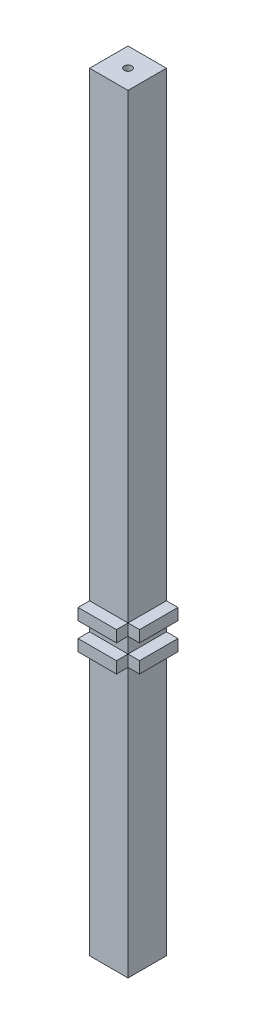
ISO-10303-21;
HEADER;
FILE_DESCRIPTION(('STEP AP214'),'2;1');
FILE_NAME('part.step','',(''),(''),'','','');
FILE_SCHEMA(('AUTOMOTIVE_DESIGN { 1 0 10303 214 1 1 1 1 }'));
ENDSEC;
DATA;
#1=APPLICATION_CONTEXT('core data for automotive mechanical design processes');
#2=APPLICATION_PROTOCOL_DEFINITION('international standard','automotive_design',2000,#1);
#3=PRODUCT_CONTEXT('',#1,'mechanical');
#4=PRODUCT('Part','Part','',(#3));
#5=PRODUCT_RELATED_PRODUCT_CATEGORY('part','',(#4));
#6=PRODUCT_DEFINITION_FORMATION('','',#4);
#7=PRODUCT_DEFINITION_CONTEXT('part definition',#1,'design');
#8=PRODUCT_DEFINITION('design','',#6,#7);
#9=PRODUCT_DEFINITION_SHAPE('','',#8);
#10=(LENGTH_UNIT() NAMED_UNIT(*) SI_UNIT(.MILLI.,.METRE.));
#11=(NAMED_UNIT(*) PLANE_ANGLE_UNIT() SI_UNIT($,.RADIAN.));
#12=(NAMED_UNIT(*) SI_UNIT($,.STERADIAN.) SOLID_ANGLE_UNIT());
#13=UNCERTAINTY_MEASURE_WITH_UNIT(LENGTH_MEASURE(1.E-05),#10,'distance_accuracy_value','');
#14=(GEOMETRIC_REPRESENTATION_CONTEXT(3) GLOBAL_UNCERTAINTY_ASSIGNED_CONTEXT((#13)) GLOBAL_UNIT_ASSIGNED_CONTEXT((#10,
#11,#12)) REPRESENTATION_CONTEXT('',''));
#15=CARTESIAN_POINT('',(0.,0.,0.));
#16=DIRECTION('',(0.,0.,1.));
#17=DIRECTION('',(1.,0.,0.));
#18=AXIS2_PLACEMENT_3D('',#15,#16,#17);
#19=CARTESIAN_POINT('',(5.,200.,5.));
#20=DIRECTION('',(-1.,0.,0.));
#21=DIRECTION('',(0.,0.,1.));
#22=AXIS2_PLACEMENT_3D('',#19,#20,#21);
#23=PLANE('',#22);
#24=DIRECTION('',(0.,0.,1.));
#25=VECTOR('',#24,1.);
#26=CARTESIAN_POINT('',(5.,73.,5.));
#27=LINE('',#26,#25);
#28=CARTESIAN_POINT('',(5.,73.,-5.));
#29=VERTEX_POINT('',#28);
#30=CARTESIAN_POINT('',(5.,73.,5.));
#31=VERTEX_POINT('',#30);
#32=EDGE_CURVE('E61',#29,#31,#27,.T.);
#33=ORIENTED_EDGE('',*,*,#32,.F.);
#34=DIRECTION('',(0.,-1.,0.));
#35=VECTOR('',#34,1.);
#36=CARTESIAN_POINT('',(5.,200.,-5.));
#37=LINE('',#36,#35);
#38=CARTESIAN_POINT('',(5.,77.,-5.));
#39=VERTEX_POINT('',#38);
#40=EDGE_CURVE('E53',#39,#29,#37,.T.);
#41=ORIENTED_EDGE('',*,*,#40,.F.);
#42=DIRECTION('',(0.,0.,-1.));
#43=VECTOR('',#42,1.);
#44=CARTESIAN_POINT('',(5.,77.,5.));
#45=LINE('',#44,#43);
#46=CARTESIAN_POINT('',(5.,77.,5.));
#47=VERTEX_POINT('',#46);
#48=EDGE_CURVE('E230',#47,#39,#45,.T.);
#49=ORIENTED_EDGE('',*,*,#48,.F.);
#50=DIRECTION('',(0.,-1.,0.));
#51=VECTOR('',#50,1.);
#52=CARTESIAN_POINT('',(5.,200.,5.));
#53=LINE('',#52,#51);
#54=EDGE_CURVE('E368',#47,#31,#53,.T.);
#55=ORIENTED_EDGE('',*,*,#54,.T.);
#56=EDGE_LOOP('',(#33,#41,#49,#55));
#57=FACE_BOUND('',#56,.T.);
#58=ADVANCED_FACE('F45',(#57),#23,.F.);
#59=DIRECTION('',(0.,-1.,0.));
#60=VECTOR('',#59,1.);
#61=CARTESIAN_POINT('',(5.,70.,5.));
#62=LINE('',#61,#60);
#63=CARTESIAN_POINT('',(5.,70.,5.));
#64=VERTEX_POINT('',#63);
#65=EDGE_CURVE('E198',#31,#64,#62,.T.);
#66=ORIENTED_EDGE('',*,*,#65,.F.);
#67=DIRECTION('',(0.,0.,-1.));
#68=VECTOR('',#67,1.);
#69=CARTESIAN_POINT('',(5.,73.,8.));
#70=LINE('',#69,#68);
#71=CARTESIAN_POINT('',(5.,73.,8.));
#72=VERTEX_POINT('',#71);
#73=EDGE_CURVE('E276',#72,#31,#70,.T.);
#74=ORIENTED_EDGE('',*,*,#73,.F.);
#75=DIRECTION('',(0.,1.,0.));
#76=VECTOR('',#75,1.);
#77=CARTESIAN_POINT('',(5.,70.,8.));
#78=LINE('',#77,#76);
#79=CARTESIAN_POINT('',(5.,70.,8.));
#80=VERTEX_POINT('',#79);
#81=EDGE_CURVE('E258',#80,#72,#78,.T.);
#82=ORIENTED_EDGE('',*,*,#81,.F.);
#83=DIRECTION('',(0.,0.,-1.));
#84=VECTOR('',#83,1.);
#85=CARTESIAN_POINT('',(5.,70.,8.));
#86=LINE('',#85,#84);
#87=EDGE_CURVE('E280',#80,#64,#86,.T.);
#88=ORIENTED_EDGE('',*,*,#87,.T.);
#89=EDGE_LOOP('',(#66,#74,#82,#88));
#90=FACE_BOUND('',#89,.T.);
#91=ADVANCED_FACE('F420',(#90),#23,.F.);
#92=DIRECTION('',(0.,0.,-1.));
#93=VECTOR('',#92,1.);
#94=CARTESIAN_POINT('',(5.,70.,5.));
#95=LINE('',#94,#93);
#96=CARTESIAN_POINT('',(5.,70.,-5.));
#97=VERTEX_POINT('',#96);
#98=EDGE_CURVE('E397',#64,#97,#95,.T.);
#99=ORIENTED_EDGE('',*,*,#98,.F.);
#100=CARTESIAN_POINT('',(5.,0.,5.));
#101=VERTEX_POINT('',#100);
#102=EDGE_CURVE('E350',#64,#101,#53,.T.);
#103=ORIENTED_EDGE('',*,*,#102,.T.);
#104=DIRECTION('',(0.,0.,-1.));
#105=VECTOR('',#104,1.);
#106=CARTESIAN_POINT('',(5.,0.,5.));
#107=LINE('',#106,#105);
#108=CARTESIAN_POINT('',(5.,0.,-5.));
#109=VERTEX_POINT('',#108);
#110=EDGE_CURVE('E332',#101,#109,#107,.T.);
#111=ORIENTED_EDGE('',*,*,#110,.T.);
#112=EDGE_CURVE('E54',#97,#109,#37,.T.);
#113=ORIENTED_EDGE('',*,*,#112,.F.);
#114=EDGE_LOOP('',(#99,#103,#111,#113));
#115=FACE_BOUND('',#114,.T.);
#116=ADVANCED_FACE('F407',(#115),#23,.F.);
#117=DIRECTION('',(0.,0.,1.));
#118=VECTOR('',#117,1.);
#119=CARTESIAN_POINT('',(5.,80.,5.));
#120=LINE('',#119,#118);
#121=CARTESIAN_POINT('',(5.,80.,-5.));
#122=VERTEX_POINT('',#121);
#123=CARTESIAN_POINT('',(5.,80.,5.));
#124=VERTEX_POINT('',#123);
#125=EDGE_CURVE('E69',#122,#124,#120,.T.);
#126=ORIENTED_EDGE('',*,*,#125,.F.);
#127=CARTESIAN_POINT('',(5.,200.,-5.));
#128=VERTEX_POINT('',#127);
#129=EDGE_CURVE('E11',#128,#122,#37,.T.);
#130=ORIENTED_EDGE('',*,*,#129,.F.);
#131=DIRECTION('',(0.,0.,-1.));
#132=VECTOR('',#131,1.);
#133=CARTESIAN_POINT('',(5.,200.,5.));
#134=LINE('',#133,#132);
#135=CARTESIAN_POINT('',(5.,200.,5.));
#136=VERTEX_POINT('',#135);
#137=EDGE_CURVE('E336',#136,#128,#134,.T.);
#138=ORIENTED_EDGE('',*,*,#137,.F.);
#139=EDGE_CURVE('E364',#136,#124,#53,.T.);
#140=ORIENTED_EDGE('',*,*,#139,.T.);
#141=EDGE_LOOP('',(#126,#130,#138,#140));
#142=FACE_BOUND('',#141,.T.);
#143=ADVANCED_FACE('F455',(#142),#23,.F.);
#144=DIRECTION('',(0.,-1.,0.));
#145=VECTOR('',#144,1.);
#146=CARTESIAN_POINT('',(5.,77.,5.));
#147=LINE('',#146,#145);
#148=EDGE_CURVE('E235',#124,#47,#147,.T.);
#149=ORIENTED_EDGE('',*,*,#148,.F.);
#150=DIRECTION('',(0.,0.,-1.));
#151=VECTOR('',#150,1.);
#152=CARTESIAN_POINT('',(5.,80.,8.));
#153=LINE('',#152,#151);
#154=CARTESIAN_POINT('',(5.,80.,8.));
#155=VERTEX_POINT('',#154);
#156=EDGE_CURVE('E292',#155,#124,#153,.T.);
#157=ORIENTED_EDGE('',*,*,#156,.F.);
#158=DIRECTION('',(0.,1.,0.));
#159=VECTOR('',#158,1.);
#160=CARTESIAN_POINT('',(5.,77.,8.));
#161=LINE('',#160,#159);
#162=CARTESIAN_POINT('',(5.,77.,8.));
#163=VERTEX_POINT('',#162);
#164=EDGE_CURVE('E311',#163,#155,#161,.T.);
#165=ORIENTED_EDGE('',*,*,#164,.F.);
#166=DIRECTION('',(0.,0.,-1.));
#167=VECTOR('',#166,1.);
#168=CARTESIAN_POINT('',(5.,77.,8.));
#169=LINE('',#168,#167);
#170=EDGE_CURVE('E205',#163,#47,#169,.T.);
#171=ORIENTED_EDGE('',*,*,#170,.T.);
#172=EDGE_LOOP('',(#149,#157,#165,#171));
#173=FACE_BOUND('',#172,.T.);
#174=ADVANCED_FACE('F450',(#173),#23,.F.);
#175=CARTESIAN_POINT('',(-5.,200.,5.));
#176=DIRECTION('',(0.,0.,-1.));
#177=DIRECTION('',(-1.,0.,0.));
#178=AXIS2_PLACEMENT_3D('',#175,#176,#177);
#179=PLANE('',#178);
#180=DIRECTION('',(-1.,0.,0.));
#181=VECTOR('',#180,1.);
#182=CARTESIAN_POINT('',(-5.,73.,5.));
#183=LINE('',#182,#181);
#184=CARTESIAN_POINT('',(-5.,73.,5.));
#185=VERTEX_POINT('',#184);
#186=EDGE_CURVE('E255',#31,#185,#183,.T.);
#187=ORIENTED_EDGE('',*,*,#186,.F.);
#188=ORIENTED_EDGE('',*,*,#54,.F.);
#189=DIRECTION('',(1.,0.,0.));
#190=VECTOR('',#189,1.);
#191=CARTESIAN_POINT('',(-5.,77.,5.));
#192=LINE('',#191,#190);
#193=CARTESIAN_POINT('',(-5.,77.,5.));
#194=VERTEX_POINT('',#193);
#195=EDGE_CURVE('E269',#194,#47,#192,.T.);
#196=ORIENTED_EDGE('',*,*,#195,.F.);
#197=DIRECTION('',(0.,-1.,0.));
#198=VECTOR('',#197,1.);
#199=CARTESIAN_POINT('',(-5.,200.,5.));
#200=LINE('',#199,#198);
#201=EDGE_CURVE('E372',#194,#185,#200,.T.);
#202=ORIENTED_EDGE('',*,*,#201,.T.);
#203=EDGE_LOOP('',(#187,#188,#196,#202));
#204=FACE_BOUND('',#203,.T.);
#205=ADVANCED_FACE('F433',(#204),#179,.F.);
#206=DIRECTION('',(1.,0.,0.));
#207=VECTOR('',#206,1.);
#208=CARTESIAN_POINT('',(-5.,70.,5.));
#209=LINE('',#208,#207);
#210=CARTESIAN_POINT('',(-5.,70.,5.));
#211=VERTEX_POINT('',#210);
#212=EDGE_CURVE('E265',#211,#64,#209,.T.);
#213=ORIENTED_EDGE('',*,*,#212,.F.);
#214=CARTESIAN_POINT('',(-5.,0.,5.));
#215=VERTEX_POINT('',#214);
#216=EDGE_CURVE('E367',#211,#215,#200,.T.);
#217=ORIENTED_EDGE('',*,*,#216,.T.);
#218=DIRECTION('',(1.,0.,0.));
#219=VECTOR('',#218,1.);
#220=CARTESIAN_POINT('',(-5.,0.,5.));
#221=LINE('',#220,#219);
#222=EDGE_CURVE('E341',#215,#101,#221,.T.);
#223=ORIENTED_EDGE('',*,*,#222,.T.);
#224=ORIENTED_EDGE('',*,*,#102,.F.);
#225=EDGE_LOOP('',(#213,#217,#223,#224));
#226=FACE_BOUND('',#225,.T.);
#227=ADVANCED_FACE('F409',(#226),#179,.F.);
#228=DIRECTION('',(-1.,0.,0.));
#229=VECTOR('',#228,1.);
#230=CARTESIAN_POINT('',(-5.,80.,5.));
#231=LINE('',#230,#229);
#232=CARTESIAN_POINT('',(-5.,80.,5.));
#233=VERTEX_POINT('',#232);
#234=EDGE_CURVE('E301',#124,#233,#231,.T.);
#235=ORIENTED_EDGE('',*,*,#234,.F.);
#236=ORIENTED_EDGE('',*,*,#139,.F.);
#237=DIRECTION('',(1.,0.,0.));
#238=VECTOR('',#237,1.);
#239=CARTESIAN_POINT('',(-5.,200.,5.));
#240=LINE('',#239,#238);
#241=CARTESIAN_POINT('',(-5.,200.,5.));
#242=VERTEX_POINT('',#241);
#243=EDGE_CURVE('E347',#242,#136,#240,.T.);
#244=ORIENTED_EDGE('',*,*,#243,.F.);
#245=EDGE_CURVE('E369',#242,#233,#200,.T.);
#246=ORIENTED_EDGE('',*,*,#245,.T.);
#247=EDGE_LOOP('',(#235,#236,#244,#246));
#248=FACE_BOUND('',#247,.T.);
#249=ADVANCED_FACE('F462',(#248),#179,.F.);
#250=CARTESIAN_POINT('',(-5.,200.,-5.));
#251=DIRECTION('',(0.,0.,1.));
#252=DIRECTION('',(1.,0.,0.));
#253=AXIS2_PLACEMENT_3D('',#250,#251,#252);
#254=PLANE('',#253);
#255=DIRECTION('',(-1.,0.,0.));
#256=VECTOR('',#255,1.);
#257=CARTESIAN_POINT('',(-5.,0.,-5.));
#258=LINE('',#257,#256);
#259=CARTESIAN_POINT('',(-5.,0.,-5.));
#260=VERTEX_POINT('',#259);
#261=EDGE_CURVE('E354',#109,#260,#258,.T.);
#262=ORIENTED_EDGE('',*,*,#261,.T.);
#263=DIRECTION('',(0.,-1.,0.));
#264=VECTOR('',#263,1.);
#265=CARTESIAN_POINT('',(-5.,200.,-5.));
#266=LINE('',#265,#264);
#267=CARTESIAN_POINT('',(-5.,200.,-5.));
#268=VERTEX_POINT('',#267);
#269=EDGE_CURVE('E371',#268,#260,#266,.T.);
#270=ORIENTED_EDGE('',*,*,#269,.F.);
#271=DIRECTION('',(-1.,0.,0.));
#272=VECTOR('',#271,1.);
#273=CARTESIAN_POINT('',(-5.,200.,-5.));
#274=LINE('',#273,#272);
#275=EDGE_CURVE('E340',#128,#268,#274,.T.);
#276=ORIENTED_EDGE('',*,*,#275,.F.);
#277=ORIENTED_EDGE('',*,*,#129,.T.);
#278=DIRECTION('',(-1.,0.,0.));
#279=VECTOR('',#278,1.);
#280=CARTESIAN_POINT('',(8.,80.,-5.));
#281=LINE('',#280,#279);
#282=CARTESIAN_POINT('',(8.,80.,-5.));
#283=VERTEX_POINT('',#282);
#284=EDGE_CURVE('E219',#283,#122,#281,.T.);
#285=ORIENTED_EDGE('',*,*,#284,.F.);
#286=DIRECTION('',(0.,1.,0.));
#287=VECTOR('',#286,1.);
#288=CARTESIAN_POINT('',(8.,77.,-5.));
#289=LINE('',#288,#287);
#290=CARTESIAN_POINT('',(8.,77.,-5.));
#291=VERTEX_POINT('',#290);
#292=EDGE_CURVE('E241',#291,#283,#289,.T.);
#293=ORIENTED_EDGE('',*,*,#292,.F.);
#294=DIRECTION('',(-1.,0.,0.));
#295=VECTOR('',#294,1.);
#296=CARTESIAN_POINT('',(8.,77.,-5.));
#297=LINE('',#296,#295);
#298=EDGE_CURVE('E215',#291,#39,#297,.T.);
#299=ORIENTED_EDGE('',*,*,#298,.T.);
#300=ORIENTED_EDGE('',*,*,#40,.T.);
#301=DIRECTION('',(-1.,0.,0.));
#302=VECTOR('',#301,1.);
#303=CARTESIAN_POINT('',(8.,73.,-5.));
#304=LINE('',#303,#302);
#305=CARTESIAN_POINT('',(8.,73.,-5.));
#306=VERTEX_POINT('',#305);
#307=EDGE_CURVE('E207',#306,#29,#304,.T.);
#308=ORIENTED_EDGE('',*,*,#307,.F.);
#309=DIRECTION('',(0.,1.,0.));
#310=VECTOR('',#309,1.);
#311=CARTESIAN_POINT('',(8.,70.,-5.));
#312=LINE('',#311,#310);
#313=CARTESIAN_POINT('',(8.,70.,-5.));
#314=VERTEX_POINT('',#313);
#315=EDGE_CURVE('E185',#314,#306,#312,.T.);
#316=ORIENTED_EDGE('',*,*,#315,.F.);
#317=DIRECTION('',(-1.,0.,0.));
#318=VECTOR('',#317,1.);
#319=CARTESIAN_POINT('',(8.,70.,-5.));
#320=LINE('',#319,#318);
#321=EDGE_CURVE('E181',#314,#97,#320,.T.);
#322=ORIENTED_EDGE('',*,*,#321,.T.);
#323=ORIENTED_EDGE('',*,*,#112,.T.);
#324=EDGE_LOOP('',(#262,#270,#276,#277,#285,#293,#299,#300,#308,#316,#322,#323));
#325=FACE_BOUND('',#324,.T.);
#326=ADVANCED_FACE('F385',(#325),#254,.F.);
#327=CARTESIAN_POINT('',(-5.,200.,5.));
#328=DIRECTION('',(1.,0.,0.));
#329=DIRECTION('',(0.,0.,-1.));
#330=AXIS2_PLACEMENT_3D('',#327,#328,#329);
#331=PLANE('',#330);
#332=DIRECTION('',(0.,0.,1.));
#333=VECTOR('',#332,1.);
#334=CARTESIAN_POINT('',(-5.,0.,5.));
#335=LINE('',#334,#333);
#336=EDGE_CURVE('E357',#260,#215,#335,.T.);
#337=ORIENTED_EDGE('',*,*,#336,.T.);
#338=ORIENTED_EDGE('',*,*,#216,.F.);
#339=DIRECTION('',(0.,0.,-1.));
#340=VECTOR('',#339,1.);
#341=CARTESIAN_POINT('',(-5.,70.,8.));
#342=LINE('',#341,#340);
#343=CARTESIAN_POINT('',(-5.,70.,8.));
#344=VERTEX_POINT('',#343);
#345=EDGE_CURVE('E284',#344,#211,#342,.T.);
#346=ORIENTED_EDGE('',*,*,#345,.F.);
#347=DIRECTION('',(0.,-1.,0.));
#348=VECTOR('',#347,1.);
#349=CARTESIAN_POINT('',(-5.,70.,8.));
#350=LINE('',#349,#348);
#351=CARTESIAN_POINT('',(-5.,73.,8.));
#352=VERTEX_POINT('',#351);
#353=EDGE_CURVE('E250',#352,#344,#350,.T.);
#354=ORIENTED_EDGE('',*,*,#353,.F.);
#355=DIRECTION('',(0.,0.,-1.));
#356=VECTOR('',#355,1.);
#357=CARTESIAN_POINT('',(-5.,73.,8.));
#358=LINE('',#357,#356);
#359=EDGE_CURVE('E264',#352,#185,#358,.T.);
#360=ORIENTED_EDGE('',*,*,#359,.T.);
#361=ORIENTED_EDGE('',*,*,#201,.F.);
#362=DIRECTION('',(0.,0.,-1.));
#363=VECTOR('',#362,1.);
#364=CARTESIAN_POINT('',(-5.,77.,8.));
#365=LINE('',#364,#363);
#366=CARTESIAN_POINT('',(-5.,77.,8.));
#367=VERTEX_POINT('',#366);
#368=EDGE_CURVE('E200',#367,#194,#365,.T.);
#369=ORIENTED_EDGE('',*,*,#368,.F.);
#370=DIRECTION('',(0.,-1.,0.));
#371=VECTOR('',#370,1.);
#372=CARTESIAN_POINT('',(-5.,77.,8.));
#373=LINE('',#372,#371);
#374=CARTESIAN_POINT('',(-5.,80.,8.));
#375=VERTEX_POINT('',#374);
#376=EDGE_CURVE('E305',#375,#367,#373,.T.);
#377=ORIENTED_EDGE('',*,*,#376,.F.);
#378=DIRECTION('',(0.,0.,-1.));
#379=VECTOR('',#378,1.);
#380=CARTESIAN_POINT('',(-5.,80.,8.));
#381=LINE('',#380,#379);
#382=EDGE_CURVE('E296',#375,#233,#381,.T.);
#383=ORIENTED_EDGE('',*,*,#382,.T.);
#384=ORIENTED_EDGE('',*,*,#245,.F.);
#385=DIRECTION('',(0.,0.,1.));
#386=VECTOR('',#385,1.);
#387=CARTESIAN_POINT('',(-5.,200.,5.));
#388=LINE('',#387,#386);
#389=EDGE_CURVE('E344',#268,#242,#388,.T.);
#390=ORIENTED_EDGE('',*,*,#389,.F.);
#391=ORIENTED_EDGE('',*,*,#269,.T.);
#392=EDGE_LOOP('',(#337,#338,#346,#354,#360,#361,#369,#377,#383,#384,#390,#391));
#393=FACE_BOUND('',#392,.T.);
#394=ADVANCED_FACE('F428',(#393),#331,.F.);
#395=CARTESIAN_POINT('',(0.,200.,0.));
#396=DIRECTION('',(0.,-1.,0.));
#397=DIRECTION('',(0.,0.,-1.));
#398=AXIS2_PLACEMENT_3D('',#395,#396,#397);
#399=PLANE('',#398);
#400=CARTESIAN_POINT('',(0.,200.,0.));
#401=DIRECTION('',(0.,1.,0.));
#402=DIRECTION('',(0.,0.,1.));
#403=AXIS2_PLACEMENT_3D('',#400,#401,#402);
#404=CIRCLE('',#403,1.);
#405=CARTESIAN_POINT('',(0.,200.,1.));
#406=VERTEX_POINT('',#405);
#407=EDGE_CURVE('E324',#406,#406,#404,.T.);
#408=ORIENTED_EDGE('',*,*,#407,.F.);
#409=EDGE_LOOP('',(#408));
#410=FACE_BOUND('',#409,.T.);
#411=ORIENTED_EDGE('',*,*,#137,.T.);
#412=ORIENTED_EDGE('',*,*,#275,.T.);
#413=ORIENTED_EDGE('',*,*,#389,.T.);
#414=ORIENTED_EDGE('',*,*,#243,.T.);
#415=EDGE_LOOP('',(#411,#412,#413,#414));
#416=FACE_BOUND('',#415,.T.);
#417=ADVANCED_FACE('F487',(#410,#416),#399,.F.);
#418=CARTESIAN_POINT('',(0.,0.,0.));
#419=DIRECTION('',(0.,-1.,0.));
#420=DIRECTION('',(0.,0.,-1.));
#421=AXIS2_PLACEMENT_3D('',#418,#419,#420);
#422=PLANE('',#421);
#423=CARTESIAN_POINT('',(0.,0.,0.));
#424=DIRECTION('',(0.,-1.,0.));
#425=DIRECTION('',(0.,0.,-1.));
#426=AXIS2_PLACEMENT_3D('',#423,#424,#425);
#427=CIRCLE('',#426,1.);
#428=CARTESIAN_POINT('',(0.,0.,-1.));
#429=VERTEX_POINT('',#428);
#430=EDGE_CURVE('E287',#429,#429,#427,.T.);
#431=ORIENTED_EDGE('',*,*,#430,.F.);
#432=EDGE_LOOP('',(#431));
#433=FACE_BOUND('',#432,.T.);
#434=ORIENTED_EDGE('',*,*,#110,.F.);
#435=ORIENTED_EDGE('',*,*,#222,.F.);
#436=ORIENTED_EDGE('',*,*,#336,.F.);
#437=ORIENTED_EDGE('',*,*,#261,.F.);
#438=EDGE_LOOP('',(#434,#435,#436,#437));
#439=FACE_BOUND('',#438,.T.);
#440=ADVANCED_FACE('F517',(#433,#439),#422,.T.);
#441=CARTESIAN_POINT('',(0.,190.,0.));
#442=DIRECTION('',(0.,1.,0.));
#443=DIRECTION('',(0.,0.,1.));
#444=AXIS2_PLACEMENT_3D('',#441,#442,#443);
#445=CYLINDRICAL_SURFACE('',#444,1.);
#446=CARTESIAN_POINT('',(0.,190.,0.));
#447=DIRECTION('',(0.,1.,0.));
#448=DIRECTION('',(0.,0.,1.));
#449=AXIS2_PLACEMENT_3D('',#446,#447,#448);
#450=CIRCLE('',#449,1.);
#451=CARTESIAN_POINT('',(0.,190.,1.));
#452=VERTEX_POINT('',#451);
#453=EDGE_CURVE('E328',#452,#452,#450,.T.);
#454=ORIENTED_EDGE('',*,*,#453,.F.);
#455=EDGE_LOOP('',(#454));
#456=FACE_BOUND('',#455,.T.);
#457=ORIENTED_EDGE('',*,*,#407,.T.);
#458=EDGE_LOOP('',(#457));
#459=FACE_BOUND('',#458,.T.);
#460=ADVANCED_FACE('F513',(#456,#459),#445,.F.);
#461=CARTESIAN_POINT('',(0.,190.,0.));
#462=DIRECTION('',(0.,1.,0.));
#463=DIRECTION('',(0.,0.,1.));
#464=AXIS2_PLACEMENT_3D('',#461,#462,#463);
#465=PLANE('',#464);
#466=ORIENTED_EDGE('',*,*,#453,.T.);
#467=EDGE_LOOP('',(#466));
#468=FACE_BOUND('',#467,.T.);
#469=ADVANCED_FACE('F509',(#468),#465,.T.);
#470=CARTESIAN_POINT('',(0.,10.,0.));
#471=DIRECTION('',(0.,-1.,0.));
#472=DIRECTION('',(0.,0.,-1.));
#473=AXIS2_PLACEMENT_3D('',#470,#471,#472);
#474=CYLINDRICAL_SURFACE('',#473,1.);
#475=CARTESIAN_POINT('',(0.,10.,0.));
#476=DIRECTION('',(0.,-1.,0.));
#477=DIRECTION('',(0.,0.,-1.));
#478=AXIS2_PLACEMENT_3D('',#475,#476,#477);
#479=CIRCLE('',#478,1.);
#480=CARTESIAN_POINT('',(0.,10.,-1.));
#481=VERTEX_POINT('',#480);
#482=EDGE_CURVE('E320',#481,#481,#479,.T.);
#483=ORIENTED_EDGE('',*,*,#482,.F.);
#484=EDGE_LOOP('',(#483));
#485=FACE_BOUND('',#484,.T.);
#486=ORIENTED_EDGE('',*,*,#430,.T.);
#487=EDGE_LOOP('',(#486));
#488=FACE_BOUND('',#487,.T.);
#489=ADVANCED_FACE('F501',(#485,#488),#474,.F.);
#490=CARTESIAN_POINT('',(0.,10.,0.));
#491=DIRECTION('',(0.,-1.,0.));
#492=DIRECTION('',(0.,0.,-1.));
#493=AXIS2_PLACEMENT_3D('',#490,#491,#492);
#494=PLANE('',#493);
#495=ORIENTED_EDGE('',*,*,#482,.T.);
#496=EDGE_LOOP('',(#495));
#497=FACE_BOUND('',#496,.T.);
#498=ADVANCED_FACE('F493',(#497),#494,.T.);
#499=CARTESIAN_POINT('',(-5.,77.,8.));
#500=DIRECTION('',(0.,1.,0.));
#501=DIRECTION('',(0.,0.,1.));
#502=AXIS2_PLACEMENT_3D('',#499,#500,#501);
#503=PLANE('',#502);
#504=ORIENTED_EDGE('',*,*,#195,.T.);
#505=ORIENTED_EDGE('',*,*,#170,.F.);
#506=DIRECTION('',(1.,0.,0.));
#507=VECTOR('',#506,1.);
#508=CARTESIAN_POINT('',(-5.,77.,8.));
#509=LINE('',#508,#507);
#510=EDGE_CURVE('E314',#367,#163,#509,.T.);
#511=ORIENTED_EDGE('',*,*,#510,.F.);
#512=ORIENTED_EDGE('',*,*,#368,.T.);
#513=EDGE_LOOP('',(#504,#505,#511,#512));
#514=FACE_BOUND('',#513,.T.);
#515=ADVANCED_FACE('F491',(#514),#503,.F.);
#516=CARTESIAN_POINT('',(-5.,80.,8.));
#517=DIRECTION('',(0.,-1.,0.));
#518=DIRECTION('',(0.,0.,-1.));
#519=AXIS2_PLACEMENT_3D('',#516,#517,#518);
#520=PLANE('',#519);
#521=ORIENTED_EDGE('',*,*,#234,.T.);
#522=ORIENTED_EDGE('',*,*,#382,.F.);
#523=DIRECTION('',(-1.,0.,0.));
#524=VECTOR('',#523,1.);
#525=CARTESIAN_POINT('',(-5.,80.,8.));
#526=LINE('',#525,#524);
#527=EDGE_CURVE('E300',#155,#375,#526,.T.);
#528=ORIENTED_EDGE('',*,*,#527,.F.);
#529=ORIENTED_EDGE('',*,*,#156,.T.);
#530=EDGE_LOOP('',(#521,#522,#528,#529));
#531=FACE_BOUND('',#530,.T.);
#532=ADVANCED_FACE('F477',(#531),#520,.F.);
#533=CARTESIAN_POINT('',(0.,0.,8.));
#534=DIRECTION('',(0.,0.,-1.));
#535=DIRECTION('',(-1.,0.,0.));
#536=AXIS2_PLACEMENT_3D('',#533,#534,#535);
#537=PLANE('',#536);
#538=ORIENTED_EDGE('',*,*,#376,.T.);
#539=ORIENTED_EDGE('',*,*,#510,.T.);
#540=ORIENTED_EDGE('',*,*,#164,.T.);
#541=ORIENTED_EDGE('',*,*,#527,.T.);
#542=EDGE_LOOP('',(#538,#539,#540,#541));
#543=FACE_BOUND('',#542,.T.);
#544=ADVANCED_FACE('F447',(#543),#537,.F.);
#545=CARTESIAN_POINT('',(-5.,70.,8.));
#546=DIRECTION('',(0.,1.,0.));
#547=DIRECTION('',(0.,0.,1.));
#548=AXIS2_PLACEMENT_3D('',#545,#546,#547);
#549=PLANE('',#548);
#550=ORIENTED_EDGE('',*,*,#212,.T.);
#551=ORIENTED_EDGE('',*,*,#87,.F.);
#552=DIRECTION('',(1.,0.,0.));
#553=VECTOR('',#552,1.);
#554=CARTESIAN_POINT('',(-5.,70.,8.));
#555=LINE('',#554,#553);
#556=EDGE_CURVE('E254',#344,#80,#555,.T.);
#557=ORIENTED_EDGE('',*,*,#556,.F.);
#558=ORIENTED_EDGE('',*,*,#345,.T.);
#559=EDGE_LOOP('',(#550,#551,#557,#558));
#560=FACE_BOUND('',#559,.T.);
#561=ADVANCED_FACE('F416',(#560),#549,.F.);
#562=CARTESIAN_POINT('',(-5.,73.,8.));
#563=DIRECTION('',(0.,-1.,0.));
#564=DIRECTION('',(0.,0.,-1.));
#565=AXIS2_PLACEMENT_3D('',#562,#563,#564);
#566=PLANE('',#565);
#567=ORIENTED_EDGE('',*,*,#186,.T.);
#568=ORIENTED_EDGE('',*,*,#359,.F.);
#569=DIRECTION('',(-1.,0.,0.));
#570=VECTOR('',#569,1.);
#571=CARTESIAN_POINT('',(-5.,73.,8.));
#572=LINE('',#571,#570);
#573=EDGE_CURVE('E261',#72,#352,#572,.T.);
#574=ORIENTED_EDGE('',*,*,#573,.F.);
#575=ORIENTED_EDGE('',*,*,#73,.T.);
#576=EDGE_LOOP('',(#567,#568,#574,#575));
#577=FACE_BOUND('',#576,.T.);
#578=ADVANCED_FACE('F437',(#577),#566,.F.);
#579=CARTESIAN_POINT('',(0.,0.,8.));
#580=DIRECTION('',(0.,0.,-1.));
#581=DIRECTION('',(-1.,0.,0.));
#582=AXIS2_PLACEMENT_3D('',#579,#580,#581);
#583=PLANE('',#582);
#584=ORIENTED_EDGE('',*,*,#353,.T.);
#585=ORIENTED_EDGE('',*,*,#556,.T.);
#586=ORIENTED_EDGE('',*,*,#81,.T.);
#587=ORIENTED_EDGE('',*,*,#573,.T.);
#588=EDGE_LOOP('',(#584,#585,#586,#587));
#589=FACE_BOUND('',#588,.T.);
#590=ADVANCED_FACE('F425',(#589),#583,.F.);
#591=CARTESIAN_POINT('',(8.,77.,5.));
#592=DIRECTION('',(0.,0.,-1.));
#593=DIRECTION('',(-1.,0.,0.));
#594=AXIS2_PLACEMENT_3D('',#591,#592,#593);
#595=PLANE('',#594);
#596=ORIENTED_EDGE('',*,*,#148,.T.);
#597=DIRECTION('',(-1.,0.,0.));
#598=VECTOR('',#597,1.);
#599=CARTESIAN_POINT('',(8.,77.,5.));
#600=LINE('',#599,#598);
#601=CARTESIAN_POINT('',(8.,77.,5.));
#602=VERTEX_POINT('',#601);
#603=EDGE_CURVE('E211',#602,#47,#600,.T.);
#604=ORIENTED_EDGE('',*,*,#603,.F.);
#605=DIRECTION('',(0.,-1.,0.));
#606=VECTOR('',#605,1.);
#607=CARTESIAN_POINT('',(8.,77.,5.));
#608=LINE('',#607,#606);
#609=CARTESIAN_POINT('',(8.,80.,5.));
#610=VERTEX_POINT('',#609);
#611=EDGE_CURVE('E231',#610,#602,#608,.T.);
#612=ORIENTED_EDGE('',*,*,#611,.F.);
#613=DIRECTION('',(-1.,0.,0.));
#614=VECTOR('',#613,1.);
#615=CARTESIAN_POINT('',(8.,80.,5.));
#616=LINE('',#615,#614);
#617=EDGE_CURVE('E223',#610,#124,#616,.T.);
#618=ORIENTED_EDGE('',*,*,#617,.T.);
#619=EDGE_LOOP('',(#596,#604,#612,#618));
#620=FACE_BOUND('',#619,.T.);
#621=ADVANCED_FACE('F445',(#620),#595,.F.);
#622=CARTESIAN_POINT('',(8.,77.,5.));
#623=DIRECTION('',(0.,1.,0.));
#624=DIRECTION('',(0.,0.,1.));
#625=AXIS2_PLACEMENT_3D('',#622,#623,#624);
#626=PLANE('',#625);
#627=ORIENTED_EDGE('',*,*,#48,.T.);
#628=ORIENTED_EDGE('',*,*,#298,.F.);
#629=DIRECTION('',(0.,0.,-1.));
#630=VECTOR('',#629,1.);
#631=CARTESIAN_POINT('',(8.,77.,5.));
#632=LINE('',#631,#630);
#633=EDGE_CURVE('E244',#602,#291,#632,.T.);
#634=ORIENTED_EDGE('',*,*,#633,.F.);
#635=ORIENTED_EDGE('',*,*,#603,.T.);
#636=EDGE_LOOP('',(#627,#628,#634,#635));
#637=FACE_BOUND('',#636,.T.);
#638=ADVANCED_FACE('F658',(#637),#626,.F.);
#639=CARTESIAN_POINT('',(8.,80.,5.));
#640=DIRECTION('',(0.,-1.,0.));
#641=DIRECTION('',(0.,0.,-1.));
#642=AXIS2_PLACEMENT_3D('',#639,#640,#641);
#643=PLANE('',#642);
#644=ORIENTED_EDGE('',*,*,#125,.T.);
#645=ORIENTED_EDGE('',*,*,#617,.F.);
#646=DIRECTION('',(0.,0.,1.));
#647=VECTOR('',#646,1.);
#648=CARTESIAN_POINT('',(8.,80.,5.));
#649=LINE('',#648,#647);
#650=EDGE_CURVE('E227',#283,#610,#649,.T.);
#651=ORIENTED_EDGE('',*,*,#650,.F.);
#652=ORIENTED_EDGE('',*,*,#284,.T.);
#653=EDGE_LOOP('',(#644,#645,#651,#652));
#654=FACE_BOUND('',#653,.T.);
#655=ADVANCED_FACE('F480',(#654),#643,.F.);
#656=CARTESIAN_POINT('',(8.,0.,0.));
#657=DIRECTION('',(-1.,0.,0.));
#658=DIRECTION('',(0.,0.,1.));
#659=AXIS2_PLACEMENT_3D('',#656,#657,#658);
#660=PLANE('',#659);
#661=ORIENTED_EDGE('',*,*,#611,.T.);
#662=ORIENTED_EDGE('',*,*,#633,.T.);
#663=ORIENTED_EDGE('',*,*,#292,.T.);
#664=ORIENTED_EDGE('',*,*,#650,.T.);
#665=EDGE_LOOP('',(#661,#662,#663,#664));
#666=FACE_BOUND('',#665,.T.);
#667=ADVANCED_FACE('F485',(#666),#660,.F.);
#668=CARTESIAN_POINT('',(8.,70.,5.));
#669=DIRECTION('',(0.,0.,-1.));
#670=DIRECTION('',(-1.,0.,0.));
#671=AXIS2_PLACEMENT_3D('',#668,#669,#670);
#672=PLANE('',#671);
#673=ORIENTED_EDGE('',*,*,#65,.T.);
#674=DIRECTION('',(-1.,0.,0.));
#675=VECTOR('',#674,1.);
#676=CARTESIAN_POINT('',(8.,70.,5.));
#677=LINE('',#676,#675);
#678=CARTESIAN_POINT('',(8.,70.,5.));
#679=VERTEX_POINT('',#678);
#680=EDGE_CURVE('E178',#679,#64,#677,.T.);
#681=ORIENTED_EDGE('',*,*,#680,.F.);
#682=DIRECTION('',(0.,-1.,0.));
#683=VECTOR('',#682,1.);
#684=CARTESIAN_POINT('',(8.,70.,5.));
#685=LINE('',#684,#683);
#686=CARTESIAN_POINT('',(8.,73.,5.));
#687=VERTEX_POINT('',#686);
#688=EDGE_CURVE('E186',#687,#679,#685,.T.);
#689=ORIENTED_EDGE('',*,*,#688,.F.);
#690=DIRECTION('',(-1.,0.,0.));
#691=VECTOR('',#690,1.);
#692=CARTESIAN_POINT('',(8.,73.,5.));
#693=LINE('',#692,#691);
#694=EDGE_CURVE('E391',#687,#31,#693,.T.);
#695=ORIENTED_EDGE('',*,*,#694,.T.);
#696=EDGE_LOOP('',(#673,#681,#689,#695));
#697=FACE_BOUND('',#696,.T.);
#698=ADVANCED_FACE('F197',(#697),#672,.F.);
#699=CARTESIAN_POINT('',(8.,70.,5.));
#700=DIRECTION('',(0.,1.,0.));
#701=DIRECTION('',(0.,0.,1.));
#702=AXIS2_PLACEMENT_3D('',#699,#700,#701);
#703=PLANE('',#702);
#704=ORIENTED_EDGE('',*,*,#98,.T.);
#705=ORIENTED_EDGE('',*,*,#321,.F.);
#706=DIRECTION('',(0.,0.,-1.));
#707=VECTOR('',#706,1.);
#708=CARTESIAN_POINT('',(8.,70.,5.));
#709=LINE('',#708,#707);
#710=EDGE_CURVE('E173',#679,#314,#709,.T.);
#711=ORIENTED_EDGE('',*,*,#710,.F.);
#712=ORIENTED_EDGE('',*,*,#680,.T.);
#713=EDGE_LOOP('',(#704,#705,#711,#712));
#714=FACE_BOUND('',#713,.T.);
#715=ADVANCED_FACE('F176',(#714),#703,.F.);
#716=CARTESIAN_POINT('',(8.,73.,5.));
#717=DIRECTION('',(0.,-1.,0.));
#718=DIRECTION('',(0.,0.,-1.));
#719=AXIS2_PLACEMENT_3D('',#716,#717,#718);
#720=PLANE('',#719);
#721=ORIENTED_EDGE('',*,*,#32,.T.);
#722=ORIENTED_EDGE('',*,*,#694,.F.);
#723=DIRECTION('',(0.,0.,1.));
#724=VECTOR('',#723,1.);
#725=CARTESIAN_POINT('',(8.,73.,5.));
#726=LINE('',#725,#724);
#727=EDGE_CURVE('E191',#306,#687,#726,.T.);
#728=ORIENTED_EDGE('',*,*,#727,.F.);
#729=ORIENTED_EDGE('',*,*,#307,.T.);
#730=EDGE_LOOP('',(#721,#722,#728,#729));
#731=FACE_BOUND('',#730,.T.);
#732=ADVANCED_FACE('F389',(#731),#720,.F.);
#733=CARTESIAN_POINT('',(8.,0.,0.));
#734=DIRECTION('',(-1.,0.,0.));
#735=DIRECTION('',(0.,0.,1.));
#736=AXIS2_PLACEMENT_3D('',#733,#734,#735);
#737=PLANE('',#736);
#738=ORIENTED_EDGE('',*,*,#688,.T.);
#739=ORIENTED_EDGE('',*,*,#710,.T.);
#740=ORIENTED_EDGE('',*,*,#315,.T.);
#741=ORIENTED_EDGE('',*,*,#727,.T.);
#742=EDGE_LOOP('',(#738,#739,#740,#741));
#743=FACE_BOUND('',#742,.T.);
#744=ADVANCED_FACE('F189',(#743),#737,.F.);
#745=CLOSED_SHELL('',(#58,#91,#116,#143,#174,#205,#227,#249,#326,#394,#417,#440,#460,#469,#489,
#498,#515,#532,#544,#561,#578,#590,#621,#638,#655,#667,#698,#715,#732,#744));
#746=MANIFOLD_SOLID_BREP('B2',#745);
#747=ADVANCED_BREP_SHAPE_REPRESENTATION('',(#18,#746),#14);
#748=SHAPE_DEFINITION_REPRESENTATION(#9,#747);
ENDSEC;
END-ISO-10303-21;
